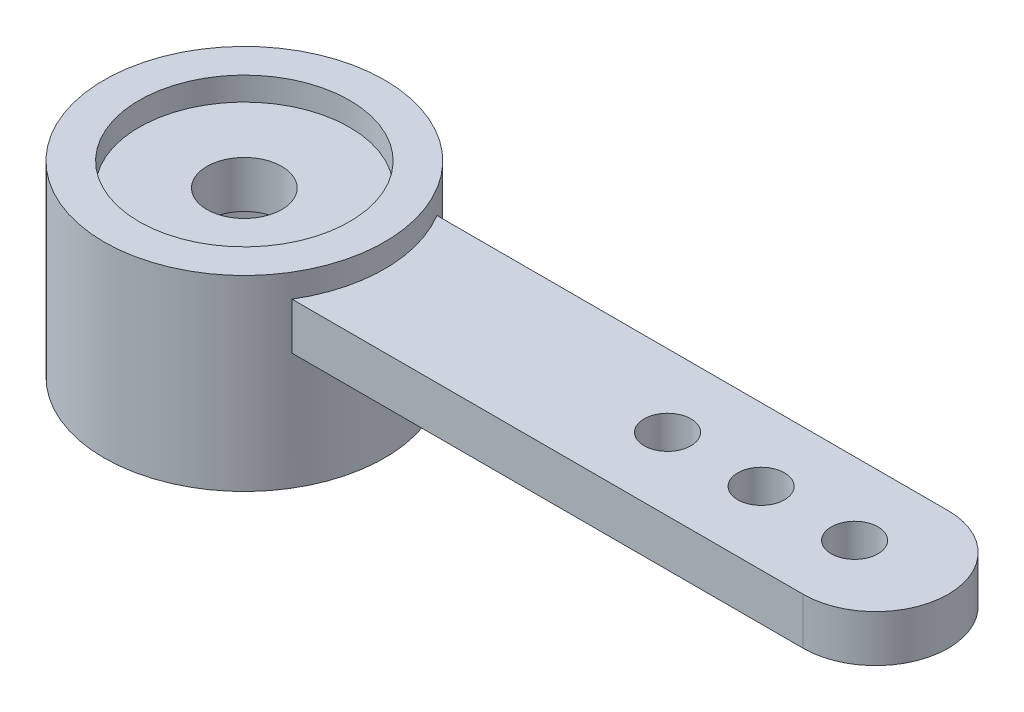
ISO-10303-21;
HEADER;
FILE_DESCRIPTION(('STEP AP214'),'2;1');
FILE_NAME('part.step','',(''),(''),'','','');
FILE_SCHEMA(('AUTOMOTIVE_DESIGN { 1 0 10303 214 1 1 1 1 }'));
ENDSEC;
DATA;
#1=APPLICATION_CONTEXT('core data for automotive mechanical design processes');
#2=APPLICATION_PROTOCOL_DEFINITION('international standard','automotive_design',2000,#1);
#3=PRODUCT_CONTEXT('',#1,'mechanical');
#4=PRODUCT('Part','Part','',(#3));
#5=PRODUCT_RELATED_PRODUCT_CATEGORY('part','',(#4));
#6=PRODUCT_DEFINITION_FORMATION('','',#4);
#7=PRODUCT_DEFINITION_CONTEXT('part definition',#1,'design');
#8=PRODUCT_DEFINITION('design','',#6,#7);
#9=PRODUCT_DEFINITION_SHAPE('','',#8);
#10=(LENGTH_UNIT() NAMED_UNIT(*) SI_UNIT(.MILLI.,.METRE.));
#11=(NAMED_UNIT(*) PLANE_ANGLE_UNIT() SI_UNIT($,.RADIAN.));
#12=(NAMED_UNIT(*) SI_UNIT($,.STERADIAN.) SOLID_ANGLE_UNIT());
#13=UNCERTAINTY_MEASURE_WITH_UNIT(LENGTH_MEASURE(1.E-05),#10,'distance_accuracy_value','');
#14=(GEOMETRIC_REPRESENTATION_CONTEXT(3) GLOBAL_UNCERTAINTY_ASSIGNED_CONTEXT((#13)) GLOBAL_UNIT_ASSIGNED_CONTEXT((#10,
#11,#12)) REPRESENTATION_CONTEXT('',''));
#15=CARTESIAN_POINT('',(0.,0.,0.));
#16=DIRECTION('',(0.,0.,1.));
#17=DIRECTION('',(1.,0.,0.));
#18=AXIS2_PLACEMENT_3D('',#15,#16,#17);
#19=CARTESIAN_POINT('',(0.,0.5,0.));
#20=DIRECTION('',(0.,-1.,0.));
#21=DIRECTION('',(0.,0.,-1.));
#22=AXIS2_PLACEMENT_3D('',#19,#20,#21);
#23=CYLINDRICAL_SURFACE('',#22,3.);
#24=CARTESIAN_POINT('',(0.,-3.5,0.));
#25=DIRECTION('',(0.,1.,0.));
#26=DIRECTION('',(0.,0.,1.));
#27=AXIS2_PLACEMENT_3D('',#24,#25,#26);
#28=CIRCLE('',#27,3.);
#29=CARTESIAN_POINT('',(0.,-3.5,3.));
#30=VERTEX_POINT('',#29);
#31=EDGE_CURVE('E137',#30,#30,#28,.T.);
#32=ORIENTED_EDGE('',*,*,#31,.T.);
#33=EDGE_LOOP('',(#32));
#34=FACE_BOUND('',#33,.T.);
#35=CARTESIAN_POINT('',(0.,0.5,0.));
#36=DIRECTION('',(0.,1.,0.));
#37=DIRECTION('',(0.,0.,1.));
#38=AXIS2_PLACEMENT_3D('',#35,#36,#37);
#39=CIRCLE('',#38,3.);
#40=CARTESIAN_POINT('',(0.,0.5,3.));
#41=VERTEX_POINT('',#40);
#42=EDGE_CURVE('E43',#41,#41,#39,.T.);
#43=ORIENTED_EDGE('',*,*,#42,.F.);
#44=EDGE_LOOP('',(#43));
#45=FACE_BOUND('',#44,.T.);
#46=CARTESIAN_POINT('',(0.,-1.,0.));
#47=DIRECTION('',(0.,1.,0.));
#48=DIRECTION('',(0.,0.,1.));
#49=AXIS2_PLACEMENT_3D('',#46,#47,#48);
#50=CIRCLE('',#49,3.);
#51=CARTESIAN_POINT('',(2.5689198407063,-1.,1.54940338583131));
#52=VERTEX_POINT('',#51);
#53=CARTESIAN_POINT('',(2.5689198407063,-1.,-1.54940338583131));
#54=VERTEX_POINT('',#53);
#55=EDGE_CURVE('E95',#52,#54,#50,.T.);
#56=ORIENTED_EDGE('',*,*,#55,.F.);
#57=DIRECTION('',(0.,1.,0.));
#58=VECTOR('',#57,1.);
#59=CARTESIAN_POINT('',(2.5689198407063,-1.,1.54940338583131));
#60=LINE('',#59,#58);
#61=CARTESIAN_POINT('',(2.5689198407063,0.,1.54940338583131));
#62=VERTEX_POINT('',#61);
#63=EDGE_CURVE('E120',#52,#62,#60,.T.);
#64=ORIENTED_EDGE('',*,*,#63,.T.);
#65=CARTESIAN_POINT('',(0.,0.,0.));
#66=DIRECTION('',(0.,1.,0.));
#67=DIRECTION('',(0.,0.,1.));
#68=AXIS2_PLACEMENT_3D('',#65,#66,#67);
#69=CIRCLE('',#68,3.);
#70=CARTESIAN_POINT('',(2.5689198407063,0.,-1.54940338583131));
#71=VERTEX_POINT('',#70);
#72=EDGE_CURVE('E74',#62,#71,#69,.T.);
#73=ORIENTED_EDGE('',*,*,#72,.T.);
#74=DIRECTION('',(0.,1.,0.));
#75=VECTOR('',#74,1.);
#76=CARTESIAN_POINT('',(2.5689198407063,-1.,-1.54940338583131));
#77=LINE('',#76,#75);
#78=EDGE_CURVE('E90',#54,#71,#77,.T.);
#79=ORIENTED_EDGE('',*,*,#78,.F.);
#80=EDGE_LOOP('',(#56,#64,#73,#79));
#81=FACE_BOUND('',#80,.T.);
#82=ADVANCED_FACE('F35',(#34,#45,#81),#23,.T.);
#83=CARTESIAN_POINT('',(0.,0.5,0.));
#84=DIRECTION('',(0.,-1.,0.));
#85=DIRECTION('',(0.,0.,-1.));
#86=AXIS2_PLACEMENT_3D('',#83,#84,#85);
#87=CYLINDRICAL_SURFACE('',#86,2.25);
#88=CARTESIAN_POINT('',(0.,-3.5,0.));
#89=DIRECTION('',(0.,1.,0.));
#90=DIRECTION('',(0.,0.,1.));
#91=AXIS2_PLACEMENT_3D('',#88,#89,#90);
#92=CIRCLE('',#91,2.25);
#93=CARTESIAN_POINT('',(0.,-3.5,2.25));
#94=VERTEX_POINT('',#93);
#95=EDGE_CURVE('E132',#94,#94,#92,.T.);
#96=ORIENTED_EDGE('',*,*,#95,.F.);
#97=EDGE_LOOP('',(#96));
#98=FACE_BOUND('',#97,.T.);
#99=CARTESIAN_POINT('',(0.,-1.,0.));
#100=DIRECTION('',(0.,1.,0.));
#101=DIRECTION('',(0.,0.,1.));
#102=AXIS2_PLACEMENT_3D('',#99,#100,#101);
#103=CIRCLE('',#102,2.25);
#104=CARTESIAN_POINT('',(0.,-1.,2.25));
#105=VERTEX_POINT('',#104);
#106=EDGE_CURVE('E129',#105,#105,#103,.T.);
#107=ORIENTED_EDGE('',*,*,#106,.T.);
#108=EDGE_LOOP('',(#107));
#109=FACE_BOUND('',#108,.T.);
#110=ADVANCED_FACE('F149',(#98,#109),#87,.F.);
#111=CARTESIAN_POINT('',(0.,0.,0.));
#112=DIRECTION('',(0.,1.,0.));
#113=DIRECTION('',(0.,0.,1.));
#114=AXIS2_PLACEMENT_3D('',#111,#112,#113);
#115=CIRCLE('',#114,2.25);
#116=CARTESIAN_POINT('',(0.,0.,2.25));
#117=VERTEX_POINT('',#116);
#118=EDGE_CURVE('E11',#117,#117,#115,.T.);
#119=ORIENTED_EDGE('',*,*,#118,.F.);
#120=EDGE_LOOP('',(#119));
#121=FACE_BOUND('',#120,.T.);
#122=CARTESIAN_POINT('',(0.,0.5,0.));
#123=DIRECTION('',(0.,1.,0.));
#124=DIRECTION('',(0.,0.,1.));
#125=AXIS2_PLACEMENT_3D('',#122,#123,#124);
#126=CIRCLE('',#125,2.25);
#127=CARTESIAN_POINT('',(0.,0.5,2.25));
#128=VERTEX_POINT('',#127);
#129=EDGE_CURVE('E140',#128,#128,#126,.T.);
#130=ORIENTED_EDGE('',*,*,#129,.T.);
#131=EDGE_LOOP('',(#130));
#132=FACE_BOUND('',#131,.T.);
#133=ADVANCED_FACE('F37',(#121,#132),#87,.F.);
#134=CARTESIAN_POINT('',(0.,0.5,0.));
#135=DIRECTION('',(0.,1.,0.));
#136=DIRECTION('',(0.,0.,1.));
#137=AXIS2_PLACEMENT_3D('',#134,#135,#136);
#138=PLANE('',#137);
#139=ORIENTED_EDGE('',*,*,#129,.F.);
#140=EDGE_LOOP('',(#139));
#141=FACE_BOUND('',#140,.T.);
#142=ORIENTED_EDGE('',*,*,#42,.T.);
#143=EDGE_LOOP('',(#142));
#144=FACE_BOUND('',#143,.T.);
#145=ADVANCED_FACE('F145',(#141,#144),#138,.T.);
#146=CARTESIAN_POINT('',(0.,-3.5,0.));
#147=DIRECTION('',(0.,1.,0.));
#148=DIRECTION('',(0.,0.,1.));
#149=AXIS2_PLACEMENT_3D('',#146,#147,#148);
#150=PLANE('',#149);
#151=ORIENTED_EDGE('',*,*,#95,.T.);
#152=EDGE_LOOP('',(#151));
#153=FACE_BOUND('',#152,.T.);
#154=ORIENTED_EDGE('',*,*,#31,.F.);
#155=EDGE_LOOP('',(#154));
#156=FACE_BOUND('',#155,.T.);
#157=ADVANCED_FACE('F194',(#153,#156),#150,.F.);
#158=CARTESIAN_POINT('',(0.,-1.,0.));
#159=DIRECTION('',(0.,1.,0.));
#160=DIRECTION('',(0.,0.,1.));
#161=AXIS2_PLACEMENT_3D('',#158,#159,#160);
#162=CYLINDRICAL_SURFACE('',#161,0.8);
#163=CARTESIAN_POINT('',(0.,-1.,0.));
#164=DIRECTION('',(0.,1.,0.));
#165=DIRECTION('',(0.,0.,1.));
#166=AXIS2_PLACEMENT_3D('',#163,#164,#165);
#167=CIRCLE('',#166,0.8);
#168=CARTESIAN_POINT('',(0.,-1.,0.8));
#169=VERTEX_POINT('',#168);
#170=EDGE_CURVE('E126',#169,#169,#167,.T.);
#171=ORIENTED_EDGE('',*,*,#170,.F.);
#172=EDGE_LOOP('',(#171));
#173=FACE_BOUND('',#172,.T.);
#174=CARTESIAN_POINT('',(0.,0.,0.));
#175=DIRECTION('',(0.,1.,0.));
#176=DIRECTION('',(0.,0.,1.));
#177=AXIS2_PLACEMENT_3D('',#174,#175,#176);
#178=CIRCLE('',#177,0.8);
#179=CARTESIAN_POINT('',(0.,0.,0.8));
#180=VERTEX_POINT('',#179);
#181=EDGE_CURVE('E123',#180,#180,#178,.T.);
#182=ORIENTED_EDGE('',*,*,#181,.T.);
#183=EDGE_LOOP('',(#182));
#184=FACE_BOUND('',#183,.T.);
#185=ADVANCED_FACE('F187',(#173,#184),#162,.F.);
#186=CARTESIAN_POINT('',(0.,-1.,0.));
#187=DIRECTION('',(0.,1.,0.));
#188=DIRECTION('',(0.,0.,1.));
#189=AXIS2_PLACEMENT_3D('',#186,#187,#188);
#190=PLANE('',#189);
#191=ORIENTED_EDGE('',*,*,#170,.T.);
#192=EDGE_LOOP('',(#191));
#193=FACE_BOUND('',#192,.T.);
#194=ORIENTED_EDGE('',*,*,#106,.F.);
#195=EDGE_LOOP('',(#194));
#196=FACE_BOUND('',#195,.T.);
#197=ADVANCED_FACE('F184',(#193,#196),#190,.F.);
#198=CARTESIAN_POINT('',(0.,0.,0.));
#199=DIRECTION('',(0.,1.,0.));
#200=DIRECTION('',(0.,0.,1.));
#201=AXIS2_PLACEMENT_3D('',#198,#199,#200);
#202=PLANE('',#201);
#203=ORIENTED_EDGE('',*,*,#181,.F.);
#204=EDGE_LOOP('',(#203));
#205=FACE_BOUND('',#204,.T.);
#206=ORIENTED_EDGE('',*,*,#118,.T.);
#207=EDGE_LOOP('',(#206));
#208=FACE_BOUND('',#207,.T.);
#209=ADVANCED_FACE('F173',(#205,#208),#202,.T.);
#210=CARTESIAN_POINT('',(0.,-1.,1.54940338583131));
#211=DIRECTION('',(0.,0.,-1.));
#212=DIRECTION('',(-1.,0.,0.));
#213=AXIS2_PLACEMENT_3D('',#210,#211,#212);
#214=PLANE('',#213);
#215=DIRECTION('',(-1.,0.,0.));
#216=VECTOR('',#215,1.);
#217=CARTESIAN_POINT('',(0.,0.,1.54940338583131));
#218=LINE('',#217,#216);
#219=CARTESIAN_POINT('',(13.5,0.,1.54940338583131));
#220=VERTEX_POINT('',#219);
#221=EDGE_CURVE('E113',#220,#62,#218,.T.);
#222=ORIENTED_EDGE('',*,*,#221,.T.);
#223=ORIENTED_EDGE('',*,*,#63,.F.);
#224=DIRECTION('',(-1.,0.,0.));
#225=VECTOR('',#224,1.);
#226=CARTESIAN_POINT('',(0.,-1.,1.54940338583131));
#227=LINE('',#226,#225);
#228=CARTESIAN_POINT('',(13.5,-1.,1.54940338583131));
#229=VERTEX_POINT('',#228);
#230=EDGE_CURVE('E59',#229,#52,#227,.T.);
#231=ORIENTED_EDGE('',*,*,#230,.F.);
#232=DIRECTION('',(0.,1.,0.));
#233=VECTOR('',#232,1.);
#234=CARTESIAN_POINT('',(13.5,-1.,1.54940338583131));
#235=LINE('',#234,#233);
#236=EDGE_CURVE('E81',#229,#220,#235,.T.);
#237=ORIENTED_EDGE('',*,*,#236,.T.);
#238=EDGE_LOOP('',(#222,#223,#231,#237));
#239=FACE_BOUND('',#238,.T.);
#240=ADVANCED_FACE('F152',(#239),#214,.F.);
#241=CARTESIAN_POINT('',(0.,-1.,-1.54940338583131));
#242=DIRECTION('',(0.,0.,-1.));
#243=DIRECTION('',(-1.,0.,0.));
#244=AXIS2_PLACEMENT_3D('',#241,#242,#243);
#245=PLANE('',#244);
#246=DIRECTION('',(-1.,0.,0.));
#247=VECTOR('',#246,1.);
#248=CARTESIAN_POINT('',(0.,0.,-1.54940338583131));
#249=LINE('',#248,#247);
#250=CARTESIAN_POINT('',(13.5,0.,-1.54940338583131));
#251=VERTEX_POINT('',#250);
#252=EDGE_CURVE('E50',#251,#71,#249,.T.);
#253=ORIENTED_EDGE('',*,*,#252,.F.);
#254=DIRECTION('',(0.,1.,0.));
#255=VECTOR('',#254,1.);
#256=CARTESIAN_POINT('',(13.5,-1.,-1.54940338583131));
#257=LINE('',#256,#255);
#258=CARTESIAN_POINT('',(13.5,-1.,-1.54940338583131));
#259=VERTEX_POINT('',#258);
#260=EDGE_CURVE('E85',#259,#251,#257,.T.);
#261=ORIENTED_EDGE('',*,*,#260,.F.);
#262=DIRECTION('',(-1.,0.,0.));
#263=VECTOR('',#262,1.);
#264=CARTESIAN_POINT('',(0.,-1.,-1.54940338583131));
#265=LINE('',#264,#263);
#266=EDGE_CURVE('E88',#259,#54,#265,.T.);
#267=ORIENTED_EDGE('',*,*,#266,.T.);
#268=ORIENTED_EDGE('',*,*,#78,.T.);
#269=EDGE_LOOP('',(#253,#261,#267,#268));
#270=FACE_BOUND('',#269,.T.);
#271=ADVANCED_FACE('F87',(#270),#245,.T.);
#272=CARTESIAN_POINT('',(13.0494033858313,-1.,0.));
#273=DIRECTION('',(0.,1.,0.));
#274=DIRECTION('',(0.,0.,1.));
#275=AXIS2_PLACEMENT_3D('',#272,#273,#274);
#276=CYLINDRICAL_SURFACE('',#275,0.500000000000001);
#277=CARTESIAN_POINT('',(13.0494033858313,-1.,0.));
#278=DIRECTION('',(0.,1.,0.));
#279=DIRECTION('',(0.,0.,1.));
#280=AXIS2_PLACEMENT_3D('',#277,#278,#279);
#281=CIRCLE('',#280,0.500000000000001);
#282=CARTESIAN_POINT('',(13.0494033858313,-1.,0.500000000000001));
#283=VERTEX_POINT('',#282);
#284=EDGE_CURVE('E99',#283,#283,#281,.T.);
#285=ORIENTED_EDGE('',*,*,#284,.F.);
#286=EDGE_LOOP('',(#285));
#287=FACE_BOUND('',#286,.T.);
#288=CARTESIAN_POINT('',(13.0494033858313,0.,0.));
#289=DIRECTION('',(0.,1.,0.));
#290=DIRECTION('',(0.,0.,1.));
#291=AXIS2_PLACEMENT_3D('',#288,#289,#290);
#292=CIRCLE('',#291,0.500000000000001);
#293=CARTESIAN_POINT('',(13.0494033858313,0.,0.500000000000001));
#294=VERTEX_POINT('',#293);
#295=EDGE_CURVE('E110',#294,#294,#292,.T.);
#296=ORIENTED_EDGE('',*,*,#295,.T.);
#297=EDGE_LOOP('',(#296));
#298=FACE_BOUND('',#297,.T.);
#299=ADVANCED_FACE('F167',(#287,#298),#276,.F.);
#300=CARTESIAN_POINT('',(11.0494033858313,-1.,0.));
#301=DIRECTION('',(0.,1.,0.));
#302=DIRECTION('',(0.,0.,1.));
#303=AXIS2_PLACEMENT_3D('',#300,#301,#302);
#304=CYLINDRICAL_SURFACE('',#303,0.500000000000001);
#305=CARTESIAN_POINT('',(11.0494033858313,-1.,0.));
#306=DIRECTION('',(0.,1.,0.));
#307=DIRECTION('',(0.,0.,1.));
#308=AXIS2_PLACEMENT_3D('',#305,#306,#307);
#309=CIRCLE('',#308,0.500000000000001);
#310=CARTESIAN_POINT('',(11.0494033858313,-1.,0.500000000000015));
#311=VERTEX_POINT('',#310);
#312=EDGE_CURVE('E324',#311,#311,#309,.T.);
#313=ORIENTED_EDGE('',*,*,#312,.F.);
#314=EDGE_LOOP('',(#313));
#315=FACE_BOUND('',#314,.T.);
#316=CARTESIAN_POINT('',(11.0494033858313,0.,0.));
#317=DIRECTION('',(0.,1.,0.));
#318=DIRECTION('',(0.,0.,1.));
#319=AXIS2_PLACEMENT_3D('',#316,#317,#318);
#320=CIRCLE('',#319,0.500000000000001);
#321=CARTESIAN_POINT('',(11.0494033858313,0.,0.500000000000015));
#322=VERTEX_POINT('',#321);
#323=EDGE_CURVE('E107',#322,#322,#320,.T.);
#324=ORIENTED_EDGE('',*,*,#323,.T.);
#325=EDGE_LOOP('',(#324));
#326=FACE_BOUND('',#325,.T.);
#327=ADVANCED_FACE('F176',(#315,#326),#304,.F.);
#328=CARTESIAN_POINT('',(9.0494033858313,-1.,0.));
#329=DIRECTION('',(0.,1.,0.));
#330=DIRECTION('',(0.,0.,1.));
#331=AXIS2_PLACEMENT_3D('',#328,#329,#330);
#332=CYLINDRICAL_SURFACE('',#331,0.500000000000001);
#333=CARTESIAN_POINT('',(9.0494033858313,-1.,0.));
#334=DIRECTION('',(0.,1.,0.));
#335=DIRECTION('',(0.,0.,1.));
#336=AXIS2_PLACEMENT_3D('',#333,#334,#335);
#337=CIRCLE('',#336,0.500000000000001);
#338=CARTESIAN_POINT('',(9.0494033858313,-1.,0.500000000000029));
#339=VERTEX_POINT('',#338);
#340=EDGE_CURVE('E119',#339,#339,#337,.T.);
#341=ORIENTED_EDGE('',*,*,#340,.F.);
#342=EDGE_LOOP('',(#341));
#343=FACE_BOUND('',#342,.T.);
#344=CARTESIAN_POINT('',(9.0494033858313,0.,0.));
#345=DIRECTION('',(0.,1.,0.));
#346=DIRECTION('',(0.,0.,1.));
#347=AXIS2_PLACEMENT_3D('',#344,#345,#346);
#348=CIRCLE('',#347,0.500000000000001);
#349=CARTESIAN_POINT('',(9.0494033858313,0.,0.500000000000029));
#350=VERTEX_POINT('',#349);
#351=EDGE_CURVE('E104',#350,#350,#348,.T.);
#352=ORIENTED_EDGE('',*,*,#351,.T.);
#353=EDGE_LOOP('',(#352));
#354=FACE_BOUND('',#353,.T.);
#355=ADVANCED_FACE('F170',(#343,#354),#332,.F.);
#356=CARTESIAN_POINT('',(13.5,-1.,0.));
#357=DIRECTION('',(0.,1.,0.));
#358=DIRECTION('',(0.,0.,1.));
#359=AXIS2_PLACEMENT_3D('',#356,#357,#358);
#360=CYLINDRICAL_SURFACE('',#359,1.54940338583131);
#361=CARTESIAN_POINT('',(13.5,0.,0.));
#362=DIRECTION('',(0.,1.,0.));
#363=DIRECTION('',(0.,0.,1.));
#364=AXIS2_PLACEMENT_3D('',#361,#362,#363);
#365=CIRCLE('',#364,1.54940338583131);
#366=EDGE_CURVE('E115',#220,#251,#365,.T.);
#367=ORIENTED_EDGE('',*,*,#366,.F.);
#368=ORIENTED_EDGE('',*,*,#236,.F.);
#369=CARTESIAN_POINT('',(13.5,-1.,0.));
#370=DIRECTION('',(0.,1.,0.));
#371=DIRECTION('',(0.,0.,1.));
#372=AXIS2_PLACEMENT_3D('',#369,#370,#371);
#373=CIRCLE('',#372,1.54940338583131);
#374=EDGE_CURVE('E93',#229,#259,#373,.T.);
#375=ORIENTED_EDGE('',*,*,#374,.T.);
#376=ORIENTED_EDGE('',*,*,#260,.T.);
#377=EDGE_LOOP('',(#367,#368,#375,#376));
#378=FACE_BOUND('',#377,.T.);
#379=ADVANCED_FACE('F97',(#378),#360,.T.);
#380=CARTESIAN_POINT('',(0.,-1.,0.));
#381=DIRECTION('',(0.,1.,0.));
#382=DIRECTION('',(0.,0.,1.));
#383=AXIS2_PLACEMENT_3D('',#380,#381,#382);
#384=PLANE('',#383);
#385=ORIENTED_EDGE('',*,*,#340,.T.);
#386=EDGE_LOOP('',(#385));
#387=FACE_BOUND('',#386,.T.);
#388=ORIENTED_EDGE('',*,*,#312,.T.);
#389=EDGE_LOOP('',(#388));
#390=FACE_BOUND('',#389,.T.);
#391=ORIENTED_EDGE('',*,*,#284,.T.);
#392=EDGE_LOOP('',(#391));
#393=FACE_BOUND('',#392,.T.);
#394=ORIENTED_EDGE('',*,*,#230,.T.);
#395=ORIENTED_EDGE('',*,*,#55,.T.);
#396=ORIENTED_EDGE('',*,*,#266,.F.);
#397=ORIENTED_EDGE('',*,*,#374,.F.);
#398=EDGE_LOOP('',(#394,#395,#396,#397));
#399=FACE_BOUND('',#398,.T.);
#400=ADVANCED_FACE('F92',(#387,#390,#393,#399),#384,.F.);
#401=CARTESIAN_POINT('',(0.,0.,0.));
#402=DIRECTION('',(0.,1.,0.));
#403=DIRECTION('',(0.,0.,1.));
#404=AXIS2_PLACEMENT_3D('',#401,#402,#403);
#405=PLANE('',#404);
#406=ORIENTED_EDGE('',*,*,#351,.F.);
#407=EDGE_LOOP('',(#406));
#408=FACE_BOUND('',#407,.T.);
#409=ORIENTED_EDGE('',*,*,#323,.F.);
#410=EDGE_LOOP('',(#409));
#411=FACE_BOUND('',#410,.T.);
#412=ORIENTED_EDGE('',*,*,#295,.F.);
#413=EDGE_LOOP('',(#412));
#414=FACE_BOUND('',#413,.T.);
#415=ORIENTED_EDGE('',*,*,#221,.F.);
#416=ORIENTED_EDGE('',*,*,#366,.T.);
#417=ORIENTED_EDGE('',*,*,#252,.T.);
#418=ORIENTED_EDGE('',*,*,#72,.F.);
#419=EDGE_LOOP('',(#415,#416,#417,#418));
#420=FACE_BOUND('',#419,.T.);
#421=ADVANCED_FACE('F153',(#408,#411,#414,#420),#405,.T.);
#422=CLOSED_SHELL('',(#82,#110,#133,#145,#157,#185,#197,#209,#240,#271,#299,#327,#355,#379,#400,#421));
#423=MANIFOLD_SOLID_BREP('B2',#422);
#424=ADVANCED_BREP_SHAPE_REPRESENTATION('',(#18,#423),#14);
#425=SHAPE_DEFINITION_REPRESENTATION(#9,#424);
ENDSEC;
END-ISO-10303-21;
